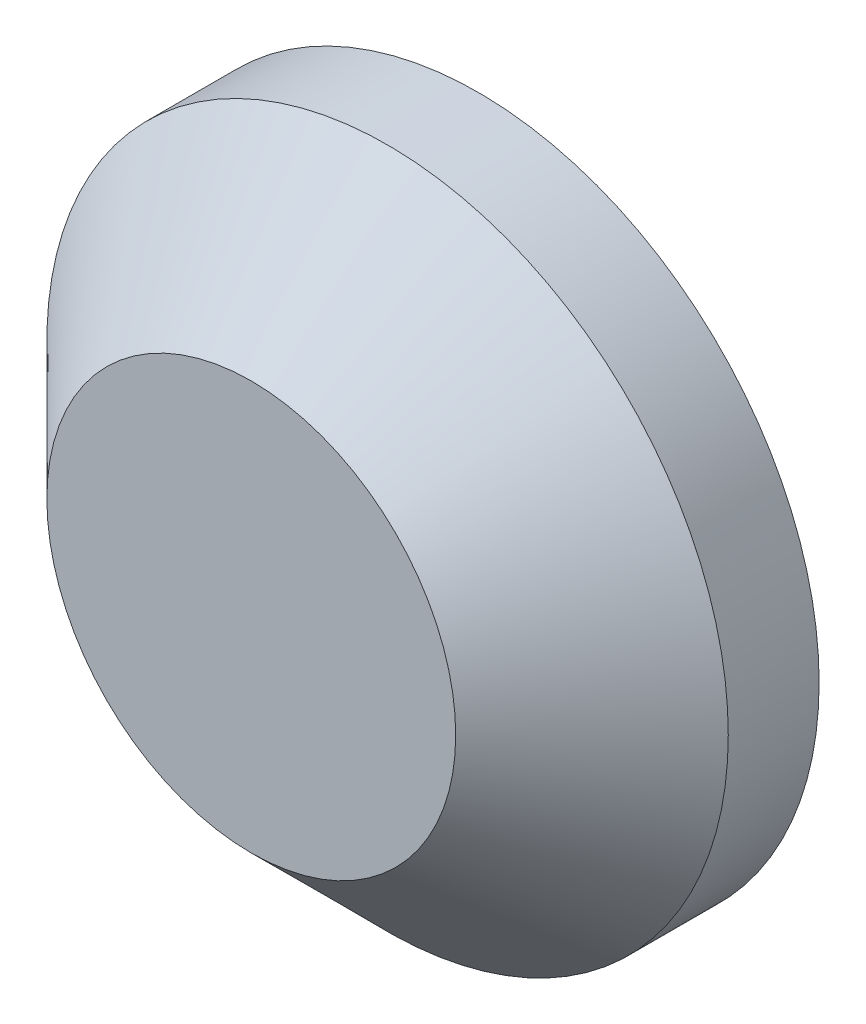
ISO-10303-21;
HEADER;
FILE_DESCRIPTION(('STEP AP214'),'2;1');
FILE_NAME('part.step','',(''),(''),'','','');
FILE_SCHEMA(('AUTOMOTIVE_DESIGN { 1 0 10303 214 1 1 1 1 }'));
ENDSEC;
DATA;
#1=APPLICATION_CONTEXT('core data for automotive mechanical design processes');
#2=APPLICATION_PROTOCOL_DEFINITION('international standard','automotive_design',2000,#1);
#3=PRODUCT_CONTEXT('',#1,'mechanical');
#4=PRODUCT('Part','Part','',(#3));
#5=PRODUCT_RELATED_PRODUCT_CATEGORY('part','',(#4));
#6=PRODUCT_DEFINITION_FORMATION('','',#4);
#7=PRODUCT_DEFINITION_CONTEXT('part definition',#1,'design');
#8=PRODUCT_DEFINITION('design','',#6,#7);
#9=PRODUCT_DEFINITION_SHAPE('','',#8);
#10=(LENGTH_UNIT() NAMED_UNIT(*) SI_UNIT(.MILLI.,.METRE.));
#11=(NAMED_UNIT(*) PLANE_ANGLE_UNIT() SI_UNIT($,.RADIAN.));
#12=(NAMED_UNIT(*) SI_UNIT($,.STERADIAN.) SOLID_ANGLE_UNIT());
#13=UNCERTAINTY_MEASURE_WITH_UNIT(LENGTH_MEASURE(1.E-05),#10,'distance_accuracy_value','');
#14=(GEOMETRIC_REPRESENTATION_CONTEXT(3) GLOBAL_UNCERTAINTY_ASSIGNED_CONTEXT((#13)) GLOBAL_UNIT_ASSIGNED_CONTEXT((#10,
#11,#12)) REPRESENTATION_CONTEXT('',''));
#15=CARTESIAN_POINT('',(0.,0.,0.));
#16=DIRECTION('',(0.,0.,1.));
#17=DIRECTION('',(1.,0.,0.));
#18=AXIS2_PLACEMENT_3D('',#15,#16,#17);
#19=CARTESIAN_POINT('',(0.,0.,5.));
#20=DIRECTION('',(0.,0.,-1.));
#21=DIRECTION('',(-1.,0.,0.));
#22=AXIS2_PLACEMENT_3D('',#19,#20,#21);
#23=CYLINDRICAL_SURFACE('',#22,7.5);
#24=CARTESIAN_POINT('',(0.,0.,2.));
#25=DIRECTION('',(0.,0.,1.));
#26=DIRECTION('',(1.,0.,0.));
#27=AXIS2_PLACEMENT_3D('',#24,#25,#26);
#28=CIRCLE('',#27,7.5);
#29=CARTESIAN_POINT('',(7.5,0.,2.));
#30=VERTEX_POINT('',#29);
#31=EDGE_CURVE('E10',#30,#30,#28,.F.);
#32=ORIENTED_EDGE('',*,*,#31,.T.);
#33=EDGE_LOOP('',(#32));
#34=FACE_BOUND('',#33,.T.);
#35=CARTESIAN_POINT('',(0.,0.,0.));
#36=DIRECTION('',(0.,0.,1.));
#37=DIRECTION('',(1.,0.,0.));
#38=AXIS2_PLACEMENT_3D('',#35,#36,#37);
#39=CIRCLE('',#38,7.5);
#40=CARTESIAN_POINT('',(7.5,0.,0.));
#41=VERTEX_POINT('',#40);
#42=EDGE_CURVE('E51',#41,#41,#39,.T.);
#43=ORIENTED_EDGE('',*,*,#42,.T.);
#44=EDGE_LOOP('',(#43));
#45=FACE_BOUND('',#44,.T.);
#46=ADVANCED_FACE('F39',(#34,#45),#23,.T.);
#47=CARTESIAN_POINT('',(0.,0.,5.));
#48=DIRECTION('',(0.,0.,1.));
#49=DIRECTION('',(1.,0.,0.));
#50=AXIS2_PLACEMENT_3D('',#47,#48,#49);
#51=PLANE('',#50);
#52=CARTESIAN_POINT('',(0.,0.,5.));
#53=DIRECTION('',(0.,0.,1.));
#54=DIRECTION('',(1.,0.,0.));
#55=AXIS2_PLACEMENT_3D('',#52,#53,#54);
#56=CIRCLE('',#55,4.50000000000001);
#57=CARTESIAN_POINT('',(4.50000000000001,0.,5.));
#58=VERTEX_POINT('',#57);
#59=EDGE_CURVE('E50',#58,#58,#56,.T.);
#60=ORIENTED_EDGE('',*,*,#59,.T.);
#61=EDGE_LOOP('',(#60));
#62=FACE_BOUND('',#61,.T.);
#63=ADVANCED_FACE('F62',(#62),#51,.T.);
#64=CARTESIAN_POINT('',(0.,0.,0.));
#65=DIRECTION('',(0.,0.,1.));
#66=DIRECTION('',(1.,0.,0.));
#67=AXIS2_PLACEMENT_3D('',#64,#65,#66);
#68=PLANE('',#67);
#69=ORIENTED_EDGE('',*,*,#42,.F.);
#70=EDGE_LOOP('',(#69));
#71=FACE_BOUND('',#70,.T.);
#72=ADVANCED_FACE('F56',(#71),#68,.F.);
#73=CARTESIAN_POINT('',(0.,0.,5.));
#74=DIRECTION('',(0.,0.,-1.));
#75=DIRECTION('',(-1.,0.,0.));
#76=AXIS2_PLACEMENT_3D('',#73,#74,#75);
#77=CONICAL_SURFACE('',#76,4.50000000000001,0.785398163397446);
#78=ORIENTED_EDGE('',*,*,#31,.F.);
#79=EDGE_LOOP('',(#78));
#80=FACE_BOUND('',#79,.T.);
#81=ORIENTED_EDGE('',*,*,#59,.F.);
#82=EDGE_LOOP('',(#81));
#83=FACE_BOUND('',#82,.T.);
#84=ADVANCED_FACE('F45',(#80,#83),#77,.T.);
#85=CLOSED_SHELL('',(#46,#63,#72,#84));
#86=MANIFOLD_SOLID_BREP('B2',#85);
#87=ADVANCED_BREP_SHAPE_REPRESENTATION('',(#18,#86),#14);
#88=SHAPE_DEFINITION_REPRESENTATION(#9,#87);
ENDSEC;
END-ISO-10303-21;
